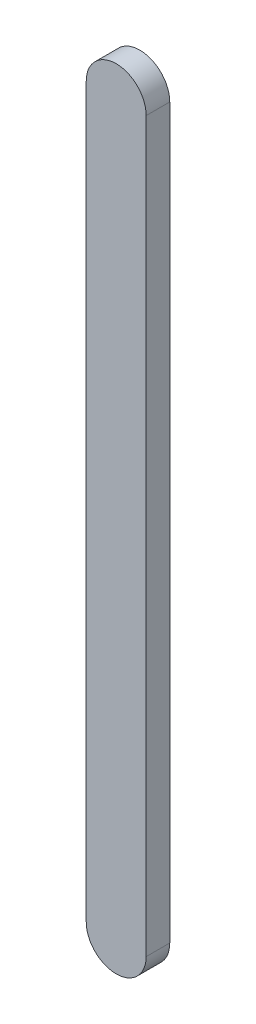
ISO-10303-21;
HEADER;
FILE_DESCRIPTION(('STEP AP214'),'2;1');
FILE_NAME('part.step','',(''),(''),'','','');
FILE_SCHEMA(('AUTOMOTIVE_DESIGN { 1 0 10303 214 1 1 1 1 }'));
ENDSEC;
DATA;
#1=APPLICATION_CONTEXT('core data for automotive mechanical design processes');
#2=APPLICATION_PROTOCOL_DEFINITION('international standard','automotive_design',2000,#1);
#3=PRODUCT_CONTEXT('',#1,'mechanical');
#4=PRODUCT('Part','Part','',(#3));
#5=PRODUCT_RELATED_PRODUCT_CATEGORY('part','',(#4));
#6=PRODUCT_DEFINITION_FORMATION('','',#4);
#7=PRODUCT_DEFINITION_CONTEXT('part definition',#1,'design');
#8=PRODUCT_DEFINITION('design','',#6,#7);
#9=PRODUCT_DEFINITION_SHAPE('','',#8);
#10=(LENGTH_UNIT() NAMED_UNIT(*) SI_UNIT(.MILLI.,.METRE.));
#11=(NAMED_UNIT(*) PLANE_ANGLE_UNIT() SI_UNIT($,.RADIAN.));
#12=(NAMED_UNIT(*) SI_UNIT($,.STERADIAN.) SOLID_ANGLE_UNIT());
#13=UNCERTAINTY_MEASURE_WITH_UNIT(LENGTH_MEASURE(1.E-05),#10,'distance_accuracy_value','');
#14=(GEOMETRIC_REPRESENTATION_CONTEXT(3) GLOBAL_UNCERTAINTY_ASSIGNED_CONTEXT((#13)) GLOBAL_UNIT_ASSIGNED_CONTEXT((#10,
#11,#12)) REPRESENTATION_CONTEXT('',''));
#15=CARTESIAN_POINT('',(0.,0.,0.));
#16=DIRECTION('',(0.,0.,1.));
#17=DIRECTION('',(1.,0.,0.));
#18=AXIS2_PLACEMENT_3D('',#15,#16,#17);
#19=CARTESIAN_POINT('',(146.558,106.2960028,0.));
#20=DIRECTION('',(-1.,0.,0.));
#21=DIRECTION('',(0.,1.,0.));
#22=AXIS2_PLACEMENT_3D('',#19,#20,#21);
#23=PLANE('',#22);
#24=DIRECTION('',(0.,1.,0.));
#25=VECTOR('',#24,1.);
#26=CARTESIAN_POINT('',(146.558,106.2960028,0.1999996));
#27=LINE('',#26,#25);
#28=CARTESIAN_POINT('',(146.558,106.2960028,0.1999996));
#29=VERTEX_POINT('',#28);
#30=CARTESIAN_POINT('',(146.558,112.4712,0.1999996));
#31=VERTEX_POINT('',#30);
#32=EDGE_CURVE('E11',#29,#31,#27,.T.);
#33=ORIENTED_EDGE('',*,*,#32,.F.);
#34=DIRECTION('',(0.,0.,1.));
#35=VECTOR('',#34,1.);
#36=CARTESIAN_POINT('',(146.558,106.2960028,0.));
#37=LINE('',#36,#35);
#38=CARTESIAN_POINT('',(146.558,106.2960028,0.));
#39=VERTEX_POINT('',#38);
#40=EDGE_CURVE('E24',#39,#29,#37,.T.);
#41=ORIENTED_EDGE('',*,*,#40,.F.);
#42=DIRECTION('',(0.,1.,0.));
#43=VECTOR('',#42,1.);
#44=CARTESIAN_POINT('',(146.558,106.2960028,0.));
#45=LINE('',#44,#43);
#46=CARTESIAN_POINT('',(146.558,112.4712,0.));
#47=VERTEX_POINT('',#46);
#48=EDGE_CURVE('E75',#39,#47,#45,.T.);
#49=ORIENTED_EDGE('',*,*,#48,.T.);
#50=DIRECTION('',(0.,0.,1.));
#51=VECTOR('',#50,1.);
#52=CARTESIAN_POINT('',(146.558,112.4712,0.));
#53=LINE('',#52,#51);
#54=EDGE_CURVE('E37',#47,#31,#53,.T.);
#55=ORIENTED_EDGE('',*,*,#54,.T.);
#56=EDGE_LOOP('',(#33,#41,#49,#55));
#57=FACE_BOUND('',#56,.T.);
#58=ADVANCED_FACE('F17',(#57),#23,.F.);
#59=CARTESIAN_POINT('',(146.304,112.4712,0.));
#60=DIRECTION('',(0.,0.,-1.));
#61=DIRECTION('',(1.,0.,0.));
#62=AXIS2_PLACEMENT_3D('',#59,#60,#61);
#63=CYLINDRICAL_SURFACE('',#62,0.253999999999991);
#64=CARTESIAN_POINT('',(146.304,112.4712,0.1999996));
#65=DIRECTION('',(0.,0.,1.));
#66=DIRECTION('',(1.,0.,0.));
#67=AXIS2_PLACEMENT_3D('',#64,#65,#66);
#68=CIRCLE('',#67,0.253999999999991);
#69=CARTESIAN_POINT('',(146.05,112.4712,0.1999996));
#70=VERTEX_POINT('',#69);
#71=EDGE_CURVE('E83',#31,#70,#68,.T.);
#72=ORIENTED_EDGE('',*,*,#71,.F.);
#73=ORIENTED_EDGE('',*,*,#54,.F.);
#74=CARTESIAN_POINT('',(146.304,112.4712,0.));
#75=DIRECTION('',(0.,0.,1.));
#76=DIRECTION('',(1.,0.,0.));
#77=AXIS2_PLACEMENT_3D('',#74,#75,#76);
#78=CIRCLE('',#77,0.253999999999991);
#79=CARTESIAN_POINT('',(146.05,112.4712,0.));
#80=VERTEX_POINT('',#79);
#81=EDGE_CURVE('E81',#47,#80,#78,.T.);
#82=ORIENTED_EDGE('',*,*,#81,.T.);
#83=DIRECTION('',(0.,0.,1.));
#84=VECTOR('',#83,1.);
#85=CARTESIAN_POINT('',(146.05,112.4712,0.));
#86=LINE('',#85,#84);
#87=EDGE_CURVE('E67',#80,#70,#86,.T.);
#88=ORIENTED_EDGE('',*,*,#87,.T.);
#89=EDGE_LOOP('',(#72,#73,#82,#88));
#90=FACE_BOUND('',#89,.T.);
#91=ADVANCED_FACE('F89',(#90),#63,.T.);
#92=CARTESIAN_POINT('',(146.05,112.4712,0.));
#93=DIRECTION('',(1.,0.,0.));
#94=DIRECTION('',(0.,-1.,0.));
#95=AXIS2_PLACEMENT_3D('',#92,#93,#94);
#96=PLANE('',#95);
#97=DIRECTION('',(0.,-1.,0.));
#98=VECTOR('',#97,1.);
#99=CARTESIAN_POINT('',(146.05,112.4712,0.1999996));
#100=LINE('',#99,#98);
#101=CARTESIAN_POINT('',(146.05,106.2960028,0.1999996));
#102=VERTEX_POINT('',#101);
#103=EDGE_CURVE('E71',#70,#102,#100,.T.);
#104=ORIENTED_EDGE('',*,*,#103,.F.);
#105=ORIENTED_EDGE('',*,*,#87,.F.);
#106=DIRECTION('',(0.,-1.,0.));
#107=VECTOR('',#106,1.);
#108=CARTESIAN_POINT('',(146.05,112.4712,0.));
#109=LINE('',#108,#107);
#110=CARTESIAN_POINT('',(146.05,106.2960028,0.));
#111=VERTEX_POINT('',#110);
#112=EDGE_CURVE('E63',#80,#111,#109,.T.);
#113=ORIENTED_EDGE('',*,*,#112,.T.);
#114=DIRECTION('',(0.,0.,1.));
#115=VECTOR('',#114,1.);
#116=CARTESIAN_POINT('',(146.05,106.2960028,0.));
#117=LINE('',#116,#115);
#118=EDGE_CURVE('E53',#111,#102,#117,.T.);
#119=ORIENTED_EDGE('',*,*,#118,.T.);
#120=EDGE_LOOP('',(#104,#105,#113,#119));
#121=FACE_BOUND('',#120,.T.);
#122=ADVANCED_FACE('F66',(#121),#96,.F.);
#123=CARTESIAN_POINT('',(146.304,106.2960028,0.));
#124=DIRECTION('',(0.,0.,-1.));
#125=DIRECTION('',(-1.,1.11896493820492E-13,0.));
#126=AXIS2_PLACEMENT_3D('',#123,#124,#125);
#127=CYLINDRICAL_SURFACE('',#126,0.253999999999986);
#128=CARTESIAN_POINT('',(146.304,106.2960028,0.1999996));
#129=DIRECTION('',(0.,0.,1.));
#130=DIRECTION('',(-1.,1.11896493820492E-13,0.));
#131=AXIS2_PLACEMENT_3D('',#128,#129,#130);
#132=CIRCLE('',#131,0.253999999999986);
#133=EDGE_CURVE('E59',#102,#29,#132,.T.);
#134=ORIENTED_EDGE('',*,*,#133,.F.);
#135=ORIENTED_EDGE('',*,*,#118,.F.);
#136=CARTESIAN_POINT('',(146.304,106.2960028,0.));
#137=DIRECTION('',(0.,0.,1.));
#138=DIRECTION('',(-1.,1.11896493820492E-13,0.));
#139=AXIS2_PLACEMENT_3D('',#136,#137,#138);
#140=CIRCLE('',#139,0.253999999999986);
#141=EDGE_CURVE('E57',#111,#39,#140,.T.);
#142=ORIENTED_EDGE('',*,*,#141,.T.);
#143=ORIENTED_EDGE('',*,*,#40,.T.);
#144=EDGE_LOOP('',(#134,#135,#142,#143));
#145=FACE_BOUND('',#144,.T.);
#146=ADVANCED_FACE('F55',(#145),#127,.T.);
#147=CARTESIAN_POINT('',(146.558,106.2960028,0.));
#148=DIRECTION('',(0.,0.,-1.));
#149=DIRECTION('',(-1.,0.,0.));
#150=AXIS2_PLACEMENT_3D('',#147,#148,#149);
#151=PLANE('',#150);
#152=ORIENTED_EDGE('',*,*,#141,.F.);
#153=ORIENTED_EDGE('',*,*,#112,.F.);
#154=ORIENTED_EDGE('',*,*,#81,.F.);
#155=ORIENTED_EDGE('',*,*,#48,.F.);
#156=EDGE_LOOP('',(#152,#153,#154,#155));
#157=FACE_BOUND('',#156,.T.);
#158=ADVANCED_FACE('F74',(#157),#151,.T.);
#159=CARTESIAN_POINT('',(146.558,106.2960028,0.1999996));
#160=DIRECTION('',(0.,0.,-1.));
#161=DIRECTION('',(-1.,0.,0.));
#162=AXIS2_PLACEMENT_3D('',#159,#160,#161);
#163=PLANE('',#162);
#164=ORIENTED_EDGE('',*,*,#32,.T.);
#165=ORIENTED_EDGE('',*,*,#71,.T.);
#166=ORIENTED_EDGE('',*,*,#103,.T.);
#167=ORIENTED_EDGE('',*,*,#133,.T.);
#168=EDGE_LOOP('',(#164,#165,#166,#167));
#169=FACE_BOUND('',#168,.T.);
#170=ADVANCED_FACE('F91',(#169),#163,.F.);
#171=CLOSED_SHELL('',(#58,#91,#122,#146,#158,#170));
#172=MANIFOLD_SOLID_BREP('B1',#171);
#173=ADVANCED_BREP_SHAPE_REPRESENTATION('',(#18,#172),#14);
#174=SHAPE_DEFINITION_REPRESENTATION(#9,#173);
ENDSEC;
END-ISO-10303-21;
